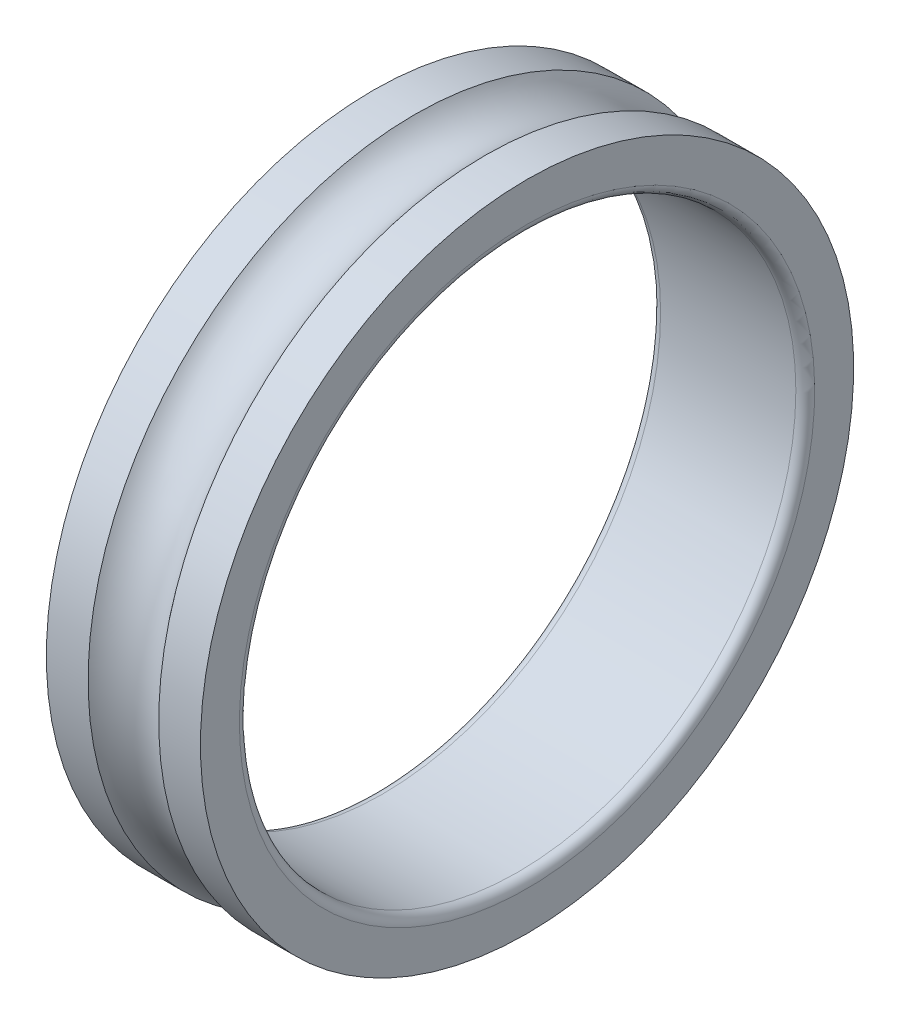
ISO-10303-21;
HEADER;
FILE_DESCRIPTION(('STEP AP214'),'2;1');
FILE_NAME('part.step','',(''),(''),'','','');
FILE_SCHEMA(('AUTOMOTIVE_DESIGN { 1 0 10303 214 1 1 1 1 }'));
ENDSEC;
DATA;
#1=APPLICATION_CONTEXT('core data for automotive mechanical design processes');
#2=APPLICATION_PROTOCOL_DEFINITION('international standard','automotive_design',2000,#1);
#3=PRODUCT_CONTEXT('',#1,'mechanical');
#4=PRODUCT('Part','Part','',(#3));
#5=PRODUCT_RELATED_PRODUCT_CATEGORY('part','',(#4));
#6=PRODUCT_DEFINITION_FORMATION('','',#4);
#7=PRODUCT_DEFINITION_CONTEXT('part definition',#1,'design');
#8=PRODUCT_DEFINITION('design','',#6,#7);
#9=PRODUCT_DEFINITION_SHAPE('','',#8);
#10=(LENGTH_UNIT() NAMED_UNIT(*) SI_UNIT(.MILLI.,.METRE.));
#11=(NAMED_UNIT(*) PLANE_ANGLE_UNIT() SI_UNIT($,.RADIAN.));
#12=(NAMED_UNIT(*) SI_UNIT($,.STERADIAN.) SOLID_ANGLE_UNIT());
#13=UNCERTAINTY_MEASURE_WITH_UNIT(LENGTH_MEASURE(1.E-05),#10,'distance_accuracy_value','');
#14=(GEOMETRIC_REPRESENTATION_CONTEXT(3) GLOBAL_UNCERTAINTY_ASSIGNED_CONTEXT((#13)) GLOBAL_UNIT_ASSIGNED_CONTEXT((#10,
#11,#12)) REPRESENTATION_CONTEXT('',''));
#15=CARTESIAN_POINT('',(0.,0.,0.));
#16=DIRECTION('',(0.,0.,1.));
#17=DIRECTION('',(1.,0.,0.));
#18=AXIS2_PLACEMENT_3D('',#15,#16,#17);
#19=CARTESIAN_POINT('',(15.562185748787,0.,0.));
#20=DIRECTION('',(-1.,0.,0.));
#21=DIRECTION('',(0.,1.,0.));
#22=AXIS2_PLACEMENT_3D('',#19,#20,#21);
#23=CYLINDRICAL_SURFACE('',#22,38.15);
#24=CARTESIAN_POINT('',(13.1243714975739,0.,0.));
#25=DIRECTION('',(1.,0.,0.));
#26=DIRECTION('',(0.,1.,0.));
#27=AXIS2_PLACEMENT_3D('',#24,#25,#26);
#28=CIRCLE('',#27,38.15);
#29=CARTESIAN_POINT('',(13.1243714975739,38.15,0.));
#30=VERTEX_POINT('',#29);
#31=EDGE_CURVE('E11',#30,#30,#28,.T.);
#32=ORIENTED_EDGE('',*,*,#31,.T.);
#33=EDGE_LOOP('',(#32));
#34=FACE_BOUND('',#33,.T.);
#35=CARTESIAN_POINT('',(18.,0.,0.));
#36=DIRECTION('',(1.,0.,0.));
#37=DIRECTION('',(0.,1.,0.));
#38=AXIS2_PLACEMENT_3D('',#35,#36,#37);
#39=CIRCLE('',#38,38.15);
#40=CARTESIAN_POINT('',(18.,38.15,0.));
#41=VERTEX_POINT('',#40);
#42=EDGE_CURVE('E62',#41,#41,#39,.T.);
#43=ORIENTED_EDGE('',*,*,#42,.F.);
#44=EDGE_LOOP('',(#43));
#45=FACE_BOUND('',#44,.T.);
#46=ADVANCED_FACE('F17',(#34,#45),#23,.T.);
#47=CARTESIAN_POINT('',(9.,0.,0.));
#48=DIRECTION('',(1.,0.,0.));
#49=DIRECTION('',(0.,0.,-1.));
#50=AXIS2_PLACEMENT_3D('',#47,#48,#49);
#51=TOROIDAL_SURFACE('',#50,41.25,5.1595);
#52=CARTESIAN_POINT('',(4.87562850242609,0.,0.));
#53=DIRECTION('',(1.,0.,0.));
#54=DIRECTION('',(0.,1.,0.));
#55=AXIS2_PLACEMENT_3D('',#52,#53,#54);
#56=CIRCLE('',#55,38.15);
#57=CARTESIAN_POINT('',(4.87562850242609,38.15,0.));
#58=VERTEX_POINT('',#57);
#59=EDGE_CURVE('E21',#58,#58,#56,.T.);
#60=ORIENTED_EDGE('',*,*,#59,.T.);
#61=EDGE_LOOP('',(#60));
#62=FACE_BOUND('',#61,.T.);
#63=ORIENTED_EDGE('',*,*,#31,.F.);
#64=EDGE_LOOP('',(#63));
#65=FACE_BOUND('',#64,.T.);
#66=ADVANCED_FACE('F84',(#62,#65),#51,.F.);
#67=CARTESIAN_POINT('',(2.43781425121304,0.,0.));
#68=DIRECTION('',(-1.,0.,0.));
#69=DIRECTION('',(0.,1.,0.));
#70=AXIS2_PLACEMENT_3D('',#67,#68,#69);
#71=CYLINDRICAL_SURFACE('',#70,38.15);
#72=CARTESIAN_POINT('',(0.,0.,0.));
#73=DIRECTION('',(1.,0.,0.));
#74=DIRECTION('',(0.,1.,0.));
#75=AXIS2_PLACEMENT_3D('',#72,#73,#74);
#76=CIRCLE('',#75,38.15);
#77=CARTESIAN_POINT('',(0.,38.15,0.));
#78=VERTEX_POINT('',#77);
#79=EDGE_CURVE('E50',#78,#78,#76,.T.);
#80=ORIENTED_EDGE('',*,*,#79,.T.);
#81=EDGE_LOOP('',(#80));
#82=FACE_BOUND('',#81,.T.);
#83=ORIENTED_EDGE('',*,*,#59,.F.);
#84=EDGE_LOOP('',(#83));
#85=FACE_BOUND('',#84,.T.);
#86=ADVANCED_FACE('F51',(#82,#85),#71,.T.);
#87=CARTESIAN_POINT('',(0.,35.875,0.));
#88=DIRECTION('',(-1.,0.,0.));
#89=DIRECTION('',(0.,-1.,0.));
#90=AXIS2_PLACEMENT_3D('',#87,#88,#89);
#91=PLANE('',#90);
#92=CARTESIAN_POINT('',(0.,0.,0.));
#93=DIRECTION('',(1.,0.,0.));
#94=DIRECTION('',(0.,1.,0.));
#95=AXIS2_PLACEMENT_3D('',#92,#93,#94);
#96=CIRCLE('',#95,33.6);
#97=CARTESIAN_POINT('',(0.,33.6,0.));
#98=VERTEX_POINT('',#97);
#99=EDGE_CURVE('E54',#98,#98,#96,.T.);
#100=ORIENTED_EDGE('',*,*,#99,.T.);
#101=EDGE_LOOP('',(#100));
#102=FACE_BOUND('',#101,.T.);
#103=ORIENTED_EDGE('',*,*,#79,.F.);
#104=EDGE_LOOP('',(#103));
#105=FACE_BOUND('',#104,.T.);
#106=ADVANCED_FACE('F94',(#102,#105),#91,.T.);
#107=CARTESIAN_POINT('',(1.1,0.,0.));
#108=DIRECTION('',(1.,0.,0.));
#109=DIRECTION('',(0.,0.,-1.));
#110=AXIS2_PLACEMENT_3D('',#107,#108,#109);
#111=TOROIDAL_SURFACE('',#110,33.6,1.1);
#112=CARTESIAN_POINT('',(1.1,0.,0.));
#113=DIRECTION('',(1.,0.,0.));
#114=DIRECTION('',(0.,1.,0.));
#115=AXIS2_PLACEMENT_3D('',#112,#113,#114);
#116=CIRCLE('',#115,32.5);
#117=CARTESIAN_POINT('',(1.1,32.5,0.));
#118=VERTEX_POINT('',#117);
#119=EDGE_CURVE('E56',#118,#118,#116,.T.);
#120=ORIENTED_EDGE('',*,*,#119,.T.);
#121=EDGE_LOOP('',(#120));
#122=FACE_BOUND('',#121,.T.);
#123=ORIENTED_EDGE('',*,*,#99,.F.);
#124=EDGE_LOOP('',(#123));
#125=FACE_BOUND('',#124,.T.);
#126=ADVANCED_FACE('F19',(#122,#125),#111,.T.);
#127=CARTESIAN_POINT('',(9.,0.,0.));
#128=DIRECTION('',(-1.,0.,0.));
#129=DIRECTION('',(0.,1.,0.));
#130=AXIS2_PLACEMENT_3D('',#127,#128,#129);
#131=CYLINDRICAL_SURFACE('',#130,32.5);
#132=CARTESIAN_POINT('',(16.9,0.,0.));
#133=DIRECTION('',(1.,0.,0.));
#134=DIRECTION('',(0.,1.,0.));
#135=AXIS2_PLACEMENT_3D('',#132,#133,#134);
#136=CIRCLE('',#135,32.5);
#137=CARTESIAN_POINT('',(16.9,32.5,0.));
#138=VERTEX_POINT('',#137);
#139=EDGE_CURVE('E61',#138,#138,#136,.T.);
#140=ORIENTED_EDGE('',*,*,#139,.T.);
#141=EDGE_LOOP('',(#140));
#142=FACE_BOUND('',#141,.T.);
#143=ORIENTED_EDGE('',*,*,#119,.F.);
#144=EDGE_LOOP('',(#143));
#145=FACE_BOUND('',#144,.T.);
#146=ADVANCED_FACE('F80',(#142,#145),#131,.F.);
#147=CARTESIAN_POINT('',(16.9,0.,0.));
#148=DIRECTION('',(1.,0.,0.));
#149=DIRECTION('',(0.,0.,-1.));
#150=AXIS2_PLACEMENT_3D('',#147,#148,#149);
#151=TOROIDAL_SURFACE('',#150,33.6,1.1);
#152=CARTESIAN_POINT('',(18.,0.,0.));
#153=DIRECTION('',(1.,0.,0.));
#154=DIRECTION('',(0.,1.,0.));
#155=AXIS2_PLACEMENT_3D('',#152,#153,#154);
#156=CIRCLE('',#155,33.6);
#157=CARTESIAN_POINT('',(18.,33.6,0.));
#158=VERTEX_POINT('',#157);
#159=EDGE_CURVE('E59',#158,#158,#156,.T.);
#160=ORIENTED_EDGE('',*,*,#159,.T.);
#161=EDGE_LOOP('',(#160));
#162=FACE_BOUND('',#161,.T.);
#163=ORIENTED_EDGE('',*,*,#139,.F.);
#164=EDGE_LOOP('',(#163));
#165=FACE_BOUND('',#164,.T.);
#166=ADVANCED_FACE('F71',(#162,#165),#151,.T.);
#167=CARTESIAN_POINT('',(18.,35.875,0.));
#168=DIRECTION('',(1.,0.,0.));
#169=DIRECTION('',(0.,1.,0.));
#170=AXIS2_PLACEMENT_3D('',#167,#168,#169);
#171=PLANE('',#170);
#172=ORIENTED_EDGE('',*,*,#42,.T.);
#173=EDGE_LOOP('',(#172));
#174=FACE_BOUND('',#173,.T.);
#175=ORIENTED_EDGE('',*,*,#159,.F.);
#176=EDGE_LOOP('',(#175));
#177=FACE_BOUND('',#176,.T.);
#178=ADVANCED_FACE('F74',(#174,#177),#171,.T.);
#179=CLOSED_SHELL('',(#46,#66,#86,#106,#126,#146,#166,#178));
#180=MANIFOLD_SOLID_BREP('B1',#179);
#181=ADVANCED_BREP_SHAPE_REPRESENTATION('',(#18,#180),#14);
#182=SHAPE_DEFINITION_REPRESENTATION(#9,#181);
ENDSEC;
END-ISO-10303-21;
